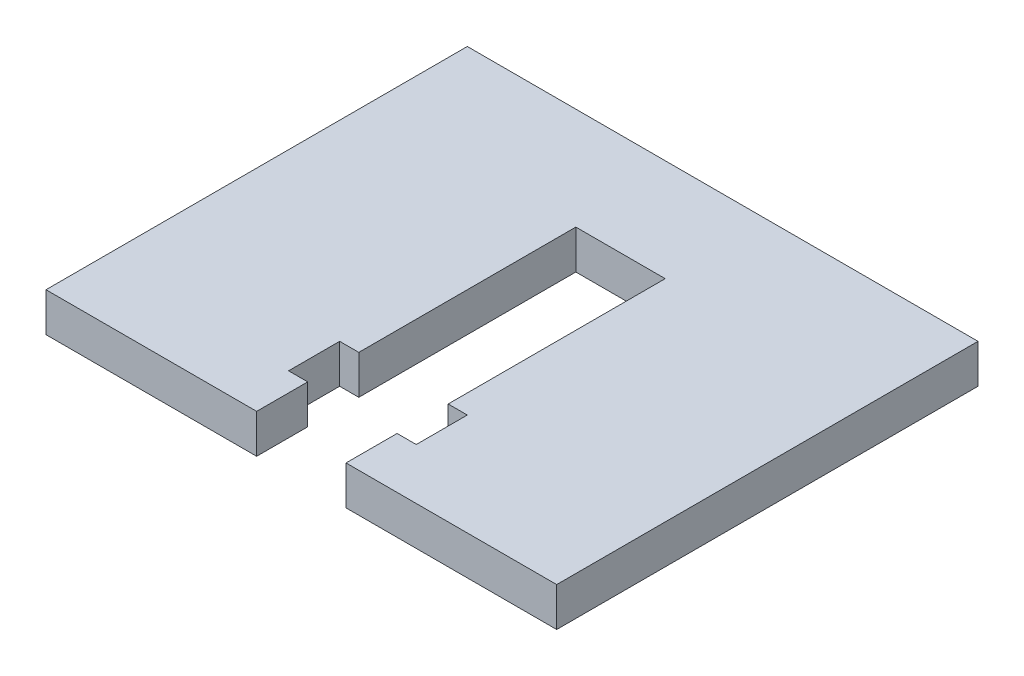
ISO-10303-21;
HEADER;
FILE_DESCRIPTION(('STEP AP214'),'2;1');
FILE_NAME('part.step','',(''),(''),'','','');
FILE_SCHEMA(('AUTOMOTIVE_DESIGN { 1 0 10303 214 1 1 1 1 }'));
ENDSEC;
DATA;
#1=APPLICATION_CONTEXT('core data for automotive mechanical design processes');
#2=APPLICATION_PROTOCOL_DEFINITION('international standard','automotive_design',2000,#1);
#3=PRODUCT_CONTEXT('',#1,'mechanical');
#4=PRODUCT('Part','Part','',(#3));
#5=PRODUCT_RELATED_PRODUCT_CATEGORY('part','',(#4));
#6=PRODUCT_DEFINITION_FORMATION('','',#4);
#7=PRODUCT_DEFINITION_CONTEXT('part definition',#1,'design');
#8=PRODUCT_DEFINITION('design','',#6,#7);
#9=PRODUCT_DEFINITION_SHAPE('','',#8);
#10=(LENGTH_UNIT() NAMED_UNIT(*) SI_UNIT(.MILLI.,.METRE.));
#11=(NAMED_UNIT(*) PLANE_ANGLE_UNIT() SI_UNIT($,.RADIAN.));
#12=(NAMED_UNIT(*) SI_UNIT($,.STERADIAN.) SOLID_ANGLE_UNIT());
#13=UNCERTAINTY_MEASURE_WITH_UNIT(LENGTH_MEASURE(1.E-05),#10,'distance_accuracy_value','');
#14=(GEOMETRIC_REPRESENTATION_CONTEXT(3) GLOBAL_UNCERTAINTY_ASSIGNED_CONTEXT((#13)) GLOBAL_UNIT_ASSIGNED_CONTEXT((#10,
#11,#12)) REPRESENTATION_CONTEXT('',''));
#15=CARTESIAN_POINT('',(0.,0.,0.));
#16=DIRECTION('',(0.,0.,1.));
#17=DIRECTION('',(1.,0.,0.));
#18=AXIS2_PLACEMENT_3D('',#15,#16,#17);
#19=CARTESIAN_POINT('',(16.5,3.05,0.));
#20=DIRECTION('',(0.,0.,-1.));
#21=DIRECTION('',(-1.,0.,0.));
#22=AXIS2_PLACEMENT_3D('',#19,#20,#21);
#23=PLANE('',#22);
#24=DIRECTION('',(1.,0.,0.));
#25=VECTOR('',#24,1.);
#26=CARTESIAN_POINT('',(16.5,0.,0.));
#27=LINE('',#26,#25);
#28=CARTESIAN_POINT('',(0.,0.,0.));
#29=VERTEX_POINT('',#28);
#30=CARTESIAN_POINT('',(16.5,0.,0.));
#31=VERTEX_POINT('',#30);
#32=EDGE_CURVE('E192',#29,#31,#27,.T.);
#33=ORIENTED_EDGE('',*,*,#32,.T.);
#34=DIRECTION('',(0.,-1.,0.));
#35=VECTOR('',#34,1.);
#36=CARTESIAN_POINT('',(16.5,3.05,0.));
#37=LINE('',#36,#35);
#38=CARTESIAN_POINT('',(16.5,3.05,0.));
#39=VERTEX_POINT('',#38);
#40=EDGE_CURVE('E11',#39,#31,#37,.T.);
#41=ORIENTED_EDGE('',*,*,#40,.F.);
#42=DIRECTION('',(1.,0.,0.));
#43=VECTOR('',#42,1.);
#44=CARTESIAN_POINT('',(16.5,3.05,0.));
#45=LINE('',#44,#43);
#46=CARTESIAN_POINT('',(0.,3.05,0.));
#47=VERTEX_POINT('',#46);
#48=EDGE_CURVE('E238',#47,#39,#45,.T.);
#49=ORIENTED_EDGE('',*,*,#48,.F.);
#50=DIRECTION('',(0.,-1.,0.));
#51=VECTOR('',#50,1.);
#52=CARTESIAN_POINT('',(0.,3.05,0.));
#53=LINE('',#52,#51);
#54=EDGE_CURVE('E188',#47,#29,#53,.T.);
#55=ORIENTED_EDGE('',*,*,#54,.T.);
#56=EDGE_LOOP('',(#33,#41,#49,#55));
#57=FACE_BOUND('',#56,.T.);
#58=ADVANCED_FACE('F43',(#57),#23,.F.);
#59=CARTESIAN_POINT('',(16.5,3.05,-3.99999999999999));
#60=DIRECTION('',(-1.,0.,0.));
#61=DIRECTION('',(0.,0.,1.));
#62=AXIS2_PLACEMENT_3D('',#59,#60,#61);
#63=PLANE('',#62);
#64=DIRECTION('',(0.,0.,-1.));
#65=VECTOR('',#64,1.);
#66=CARTESIAN_POINT('',(16.5,0.,-3.99999999999999));
#67=LINE('',#66,#65);
#68=CARTESIAN_POINT('',(16.5,0.,-3.99999999999999));
#69=VERTEX_POINT('',#68);
#70=EDGE_CURVE('E196',#31,#69,#67,.T.);
#71=ORIENTED_EDGE('',*,*,#70,.T.);
#72=DIRECTION('',(0.,-1.,0.));
#73=VECTOR('',#72,1.);
#74=CARTESIAN_POINT('',(16.5,3.05,-3.99999999999999));
#75=LINE('',#74,#73);
#76=CARTESIAN_POINT('',(16.5,3.05,-3.99999999999999));
#77=VERTEX_POINT('',#76);
#78=EDGE_CURVE('E52',#77,#69,#75,.T.);
#79=ORIENTED_EDGE('',*,*,#78,.F.);
#80=DIRECTION('',(0.,0.,-1.));
#81=VECTOR('',#80,1.);
#82=CARTESIAN_POINT('',(16.5,3.05,-3.99999999999999));
#83=LINE('',#82,#81);
#84=EDGE_CURVE('E127',#39,#77,#83,.T.);
#85=ORIENTED_EDGE('',*,*,#84,.F.);
#86=ORIENTED_EDGE('',*,*,#40,.T.);
#87=EDGE_LOOP('',(#71,#79,#85,#86));
#88=FACE_BOUND('',#87,.T.);
#89=ADVANCED_FACE('F360',(#88),#63,.F.);
#90=CARTESIAN_POINT('',(15.,3.05,-3.99999999999999));
#91=DIRECTION('',(0.,0.,1.));
#92=DIRECTION('',(1.,0.,0.));
#93=AXIS2_PLACEMENT_3D('',#90,#91,#92);
#94=PLANE('',#93);
#95=DIRECTION('',(-1.,0.,0.));
#96=VECTOR('',#95,1.);
#97=CARTESIAN_POINT('',(15.,0.,-3.99999999999999));
#98=LINE('',#97,#96);
#99=CARTESIAN_POINT('',(15.,0.,-3.99999999999999));
#100=VERTEX_POINT('',#99);
#101=EDGE_CURVE('E199',#69,#100,#98,.T.);
#102=ORIENTED_EDGE('',*,*,#101,.T.);
#103=DIRECTION('',(0.,-1.,0.));
#104=VECTOR('',#103,1.);
#105=CARTESIAN_POINT('',(15.,3.05,-3.99999999999999));
#106=LINE('',#105,#104);
#107=CARTESIAN_POINT('',(15.,3.05,-3.99999999999999));
#108=VERTEX_POINT('',#107);
#109=EDGE_CURVE('E281',#108,#100,#106,.T.);
#110=ORIENTED_EDGE('',*,*,#109,.F.);
#111=DIRECTION('',(-1.,0.,0.));
#112=VECTOR('',#111,1.);
#113=CARTESIAN_POINT('',(15.,3.05,-3.99999999999999));
#114=LINE('',#113,#112);
#115=EDGE_CURVE('E291',#77,#108,#114,.T.);
#116=ORIENTED_EDGE('',*,*,#115,.F.);
#117=ORIENTED_EDGE('',*,*,#78,.T.);
#118=EDGE_LOOP('',(#102,#110,#116,#117));
#119=FACE_BOUND('',#118,.T.);
#120=ADVANCED_FACE('F289',(#119),#94,.F.);
#121=CARTESIAN_POINT('',(15.,3.05,-7.99999999999999));
#122=DIRECTION('',(-1.,0.,0.));
#123=DIRECTION('',(0.,0.,1.));
#124=AXIS2_PLACEMENT_3D('',#121,#122,#123);
#125=PLANE('',#124);
#126=DIRECTION('',(0.,0.,-1.));
#127=VECTOR('',#126,1.);
#128=CARTESIAN_POINT('',(15.,0.,-7.99999999999999));
#129=LINE('',#128,#127);
#130=CARTESIAN_POINT('',(15.,0.,-7.99999999999999));
#131=VERTEX_POINT('',#130);
#132=EDGE_CURVE('E202',#100,#131,#129,.T.);
#133=ORIENTED_EDGE('',*,*,#132,.T.);
#134=DIRECTION('',(0.,-1.,0.));
#135=VECTOR('',#134,1.);
#136=CARTESIAN_POINT('',(15.,3.05,-7.99999999999999));
#137=LINE('',#136,#135);
#138=CARTESIAN_POINT('',(15.,3.05,-7.99999999999999));
#139=VERTEX_POINT('',#138);
#140=EDGE_CURVE('E277',#139,#131,#137,.T.);
#141=ORIENTED_EDGE('',*,*,#140,.F.);
#142=DIRECTION('',(0.,0.,-1.));
#143=VECTOR('',#142,1.);
#144=CARTESIAN_POINT('',(15.,3.05,-7.99999999999999));
#145=LINE('',#144,#143);
#146=EDGE_CURVE('E310',#108,#139,#145,.T.);
#147=ORIENTED_EDGE('',*,*,#146,.F.);
#148=ORIENTED_EDGE('',*,*,#109,.T.);
#149=EDGE_LOOP('',(#133,#141,#147,#148));
#150=FACE_BOUND('',#149,.T.);
#151=ADVANCED_FACE('F300',(#150),#125,.F.);
#152=CARTESIAN_POINT('',(16.5,3.05,-7.99999999999999));
#153=DIRECTION('',(0.,0.,-1.));
#154=DIRECTION('',(-1.,0.,0.));
#155=AXIS2_PLACEMENT_3D('',#152,#153,#154);
#156=PLANE('',#155);
#157=DIRECTION('',(1.,0.,0.));
#158=VECTOR('',#157,1.);
#159=CARTESIAN_POINT('',(16.5,0.,-7.99999999999999));
#160=LINE('',#159,#158);
#161=CARTESIAN_POINT('',(16.5,0.,-7.99999999999999));
#162=VERTEX_POINT('',#161);
#163=EDGE_CURVE('E205',#131,#162,#160,.T.);
#164=ORIENTED_EDGE('',*,*,#163,.T.);
#165=DIRECTION('',(0.,-1.,0.));
#166=VECTOR('',#165,1.);
#167=CARTESIAN_POINT('',(16.5,3.05,-7.99999999999999));
#168=LINE('',#167,#166);
#169=CARTESIAN_POINT('',(16.5,3.05,-7.99999999999999));
#170=VERTEX_POINT('',#169);
#171=EDGE_CURVE('E273',#170,#162,#168,.T.);
#172=ORIENTED_EDGE('',*,*,#171,.F.);
#173=DIRECTION('',(1.,0.,0.));
#174=VECTOR('',#173,1.);
#175=CARTESIAN_POINT('',(16.5,3.05,-7.99999999999999));
#176=LINE('',#175,#174);
#177=EDGE_CURVE('E306',#139,#170,#176,.T.);
#178=ORIENTED_EDGE('',*,*,#177,.F.);
#179=ORIENTED_EDGE('',*,*,#140,.T.);
#180=EDGE_LOOP('',(#164,#172,#178,#179));
#181=FACE_BOUND('',#180,.T.);
#182=ADVANCED_FACE('F304',(#181),#156,.F.);
#183=CARTESIAN_POINT('',(16.5,3.05,-25.));
#184=DIRECTION('',(-1.,0.,0.));
#185=DIRECTION('',(0.,0.,1.));
#186=AXIS2_PLACEMENT_3D('',#183,#184,#185);
#187=PLANE('',#186);
#188=DIRECTION('',(0.,0.,-1.));
#189=VECTOR('',#188,1.);
#190=CARTESIAN_POINT('',(16.5,0.,-25.));
#191=LINE('',#190,#189);
#192=CARTESIAN_POINT('',(16.5,0.,-25.));
#193=VERTEX_POINT('',#192);
#194=EDGE_CURVE('E208',#162,#193,#191,.T.);
#195=ORIENTED_EDGE('',*,*,#194,.T.);
#196=DIRECTION('',(0.,-1.,0.));
#197=VECTOR('',#196,1.);
#198=CARTESIAN_POINT('',(16.5,3.05,-25.));
#199=LINE('',#198,#197);
#200=CARTESIAN_POINT('',(16.5,3.05,-25.));
#201=VERTEX_POINT('',#200);
#202=EDGE_CURVE('E269',#201,#193,#199,.T.);
#203=ORIENTED_EDGE('',*,*,#202,.F.);
#204=DIRECTION('',(0.,0.,-1.));
#205=VECTOR('',#204,1.);
#206=CARTESIAN_POINT('',(16.5,3.05,-25.));
#207=LINE('',#206,#205);
#208=EDGE_CURVE('E309',#170,#201,#207,.T.);
#209=ORIENTED_EDGE('',*,*,#208,.F.);
#210=ORIENTED_EDGE('',*,*,#171,.T.);
#211=EDGE_LOOP('',(#195,#203,#209,#210));
#212=FACE_BOUND('',#211,.T.);
#213=ADVANCED_FACE('F373',(#212),#187,.F.);
#214=CARTESIAN_POINT('',(23.5,3.05,-25.));
#215=DIRECTION('',(0.,0.,-1.));
#216=DIRECTION('',(-1.,0.,0.));
#217=AXIS2_PLACEMENT_3D('',#214,#215,#216);
#218=PLANE('',#217);
#219=DIRECTION('',(1.,0.,0.));
#220=VECTOR('',#219,1.);
#221=CARTESIAN_POINT('',(23.5,0.,-25.));
#222=LINE('',#221,#220);
#223=CARTESIAN_POINT('',(23.5,0.,-25.));
#224=VERTEX_POINT('',#223);
#225=EDGE_CURVE('E211',#193,#224,#222,.T.);
#226=ORIENTED_EDGE('',*,*,#225,.T.);
#227=DIRECTION('',(0.,-1.,0.));
#228=VECTOR('',#227,1.);
#229=CARTESIAN_POINT('',(23.5,3.05,-25.));
#230=LINE('',#229,#228);
#231=CARTESIAN_POINT('',(23.5,3.05,-25.));
#232=VERTEX_POINT('',#231);
#233=EDGE_CURVE('E265',#232,#224,#230,.T.);
#234=ORIENTED_EDGE('',*,*,#233,.F.);
#235=DIRECTION('',(1.,0.,0.));
#236=VECTOR('',#235,1.);
#237=CARTESIAN_POINT('',(23.5,3.05,-25.));
#238=LINE('',#237,#236);
#239=EDGE_CURVE('E314',#201,#232,#238,.T.);
#240=ORIENTED_EDGE('',*,*,#239,.F.);
#241=ORIENTED_EDGE('',*,*,#202,.T.);
#242=EDGE_LOOP('',(#226,#234,#240,#241));
#243=FACE_BOUND('',#242,.T.);
#244=ADVANCED_FACE('F376',(#243),#218,.F.);
#245=CARTESIAN_POINT('',(23.5,3.05,-7.99999999999999));
#246=DIRECTION('',(1.,0.,0.));
#247=DIRECTION('',(0.,0.,-1.));
#248=AXIS2_PLACEMENT_3D('',#245,#246,#247);
#249=PLANE('',#248);
#250=DIRECTION('',(0.,0.,1.));
#251=VECTOR('',#250,1.);
#252=CARTESIAN_POINT('',(23.5,0.,-7.99999999999999));
#253=LINE('',#252,#251);
#254=CARTESIAN_POINT('',(23.5,0.,-7.99999999999999));
#255=VERTEX_POINT('',#254);
#256=EDGE_CURVE('E214',#224,#255,#253,.T.);
#257=ORIENTED_EDGE('',*,*,#256,.T.);
#258=DIRECTION('',(0.,-1.,0.));
#259=VECTOR('',#258,1.);
#260=CARTESIAN_POINT('',(23.5,3.05,-7.99999999999999));
#261=LINE('',#260,#259);
#262=CARTESIAN_POINT('',(23.5,3.05,-7.99999999999999));
#263=VERTEX_POINT('',#262);
#264=EDGE_CURVE('E261',#263,#255,#261,.T.);
#265=ORIENTED_EDGE('',*,*,#264,.F.);
#266=DIRECTION('',(0.,0.,1.));
#267=VECTOR('',#266,1.);
#268=CARTESIAN_POINT('',(23.5,3.05,-7.99999999999999));
#269=LINE('',#268,#267);
#270=EDGE_CURVE('E321',#232,#263,#269,.T.);
#271=ORIENTED_EDGE('',*,*,#270,.F.);
#272=ORIENTED_EDGE('',*,*,#233,.T.);
#273=EDGE_LOOP('',(#257,#265,#271,#272));
#274=FACE_BOUND('',#273,.T.);
#275=ADVANCED_FACE('F380',(#274),#249,.F.);
#276=CARTESIAN_POINT('',(25.,3.05,-7.99999999999999));
#277=DIRECTION('',(0.,0.,-1.));
#278=DIRECTION('',(-1.,0.,0.));
#279=AXIS2_PLACEMENT_3D('',#276,#277,#278);
#280=PLANE('',#279);
#281=DIRECTION('',(1.,0.,0.));
#282=VECTOR('',#281,1.);
#283=CARTESIAN_POINT('',(25.,0.,-7.99999999999999));
#284=LINE('',#283,#282);
#285=CARTESIAN_POINT('',(25.,0.,-7.99999999999999));
#286=VERTEX_POINT('',#285);
#287=EDGE_CURVE('E217',#255,#286,#284,.T.);
#288=ORIENTED_EDGE('',*,*,#287,.T.);
#289=DIRECTION('',(0.,-1.,0.));
#290=VECTOR('',#289,1.);
#291=CARTESIAN_POINT('',(25.,3.05,-7.99999999999999));
#292=LINE('',#291,#290);
#293=CARTESIAN_POINT('',(25.,3.05,-7.99999999999999));
#294=VERTEX_POINT('',#293);
#295=EDGE_CURVE('E257',#294,#286,#292,.T.);
#296=ORIENTED_EDGE('',*,*,#295,.F.);
#297=DIRECTION('',(1.,0.,0.));
#298=VECTOR('',#297,1.);
#299=CARTESIAN_POINT('',(25.,3.05,-7.99999999999999));
#300=LINE('',#299,#298);
#301=EDGE_CURVE('E324',#263,#294,#300,.T.);
#302=ORIENTED_EDGE('',*,*,#301,.F.);
#303=ORIENTED_EDGE('',*,*,#264,.T.);
#304=EDGE_LOOP('',(#288,#296,#302,#303));
#305=FACE_BOUND('',#304,.T.);
#306=ADVANCED_FACE('F384',(#305),#280,.F.);
#307=CARTESIAN_POINT('',(25.,3.05,-3.99999999999999));
#308=DIRECTION('',(1.,0.,0.));
#309=DIRECTION('',(0.,0.,-1.));
#310=AXIS2_PLACEMENT_3D('',#307,#308,#309);
#311=PLANE('',#310);
#312=DIRECTION('',(0.,0.,1.));
#313=VECTOR('',#312,1.);
#314=CARTESIAN_POINT('',(25.,0.,-3.99999999999999));
#315=LINE('',#314,#313);
#316=CARTESIAN_POINT('',(25.,0.,-3.99999999999999));
#317=VERTEX_POINT('',#316);
#318=EDGE_CURVE('E220',#286,#317,#315,.T.);
#319=ORIENTED_EDGE('',*,*,#318,.T.);
#320=DIRECTION('',(0.,-1.,0.));
#321=VECTOR('',#320,1.);
#322=CARTESIAN_POINT('',(25.,3.05,-3.99999999999999));
#323=LINE('',#322,#321);
#324=CARTESIAN_POINT('',(25.,3.05,-3.99999999999999));
#325=VERTEX_POINT('',#324);
#326=EDGE_CURVE('E253',#325,#317,#323,.T.);
#327=ORIENTED_EDGE('',*,*,#326,.F.);
#328=DIRECTION('',(0.,0.,1.));
#329=VECTOR('',#328,1.);
#330=CARTESIAN_POINT('',(25.,3.05,-3.99999999999999));
#331=LINE('',#330,#329);
#332=EDGE_CURVE('E327',#294,#325,#331,.T.);
#333=ORIENTED_EDGE('',*,*,#332,.F.);
#334=ORIENTED_EDGE('',*,*,#295,.T.);
#335=EDGE_LOOP('',(#319,#327,#333,#334));
#336=FACE_BOUND('',#335,.T.);
#337=ADVANCED_FACE('F388',(#336),#311,.F.);
#338=CARTESIAN_POINT('',(23.5,3.05,-3.99999999999999));
#339=DIRECTION('',(0.,0.,1.));
#340=DIRECTION('',(1.,0.,0.));
#341=AXIS2_PLACEMENT_3D('',#338,#339,#340);
#342=PLANE('',#341);
#343=DIRECTION('',(-1.,0.,0.));
#344=VECTOR('',#343,1.);
#345=CARTESIAN_POINT('',(23.5,0.,-3.99999999999999));
#346=LINE('',#345,#344);
#347=CARTESIAN_POINT('',(23.5,0.,-3.99999999999999));
#348=VERTEX_POINT('',#347);
#349=EDGE_CURVE('E223',#317,#348,#346,.T.);
#350=ORIENTED_EDGE('',*,*,#349,.T.);
#351=DIRECTION('',(0.,-1.,0.));
#352=VECTOR('',#351,1.);
#353=CARTESIAN_POINT('',(23.5,3.05,-3.99999999999999));
#354=LINE('',#353,#352);
#355=CARTESIAN_POINT('',(23.5,3.05,-3.99999999999999));
#356=VERTEX_POINT('',#355);
#357=EDGE_CURVE('E249',#356,#348,#354,.T.);
#358=ORIENTED_EDGE('',*,*,#357,.F.);
#359=DIRECTION('',(-1.,0.,0.));
#360=VECTOR('',#359,1.);
#361=CARTESIAN_POINT('',(23.5,3.05,-3.99999999999999));
#362=LINE('',#361,#360);
#363=EDGE_CURVE('E330',#325,#356,#362,.T.);
#364=ORIENTED_EDGE('',*,*,#363,.F.);
#365=ORIENTED_EDGE('',*,*,#326,.T.);
#366=EDGE_LOOP('',(#350,#358,#364,#365));
#367=FACE_BOUND('',#366,.T.);
#368=ADVANCED_FACE('F392',(#367),#342,.F.);
#369=CARTESIAN_POINT('',(23.5,3.05,0.));
#370=DIRECTION('',(1.,0.,0.));
#371=DIRECTION('',(0.,0.,-1.));
#372=AXIS2_PLACEMENT_3D('',#369,#370,#371);
#373=PLANE('',#372);
#374=DIRECTION('',(0.,0.,1.));
#375=VECTOR('',#374,1.);
#376=CARTESIAN_POINT('',(23.5,0.,0.));
#377=LINE('',#376,#375);
#378=CARTESIAN_POINT('',(23.5,0.,0.));
#379=VERTEX_POINT('',#378);
#380=EDGE_CURVE('E226',#348,#379,#377,.T.);
#381=ORIENTED_EDGE('',*,*,#380,.T.);
#382=DIRECTION('',(0.,-1.,0.));
#383=VECTOR('',#382,1.);
#384=CARTESIAN_POINT('',(23.5,3.05,0.));
#385=LINE('',#384,#383);
#386=CARTESIAN_POINT('',(23.5,3.05,0.));
#387=VERTEX_POINT('',#386);
#388=EDGE_CURVE('E245',#387,#379,#385,.T.);
#389=ORIENTED_EDGE('',*,*,#388,.F.);
#390=DIRECTION('',(0.,0.,1.));
#391=VECTOR('',#390,1.);
#392=CARTESIAN_POINT('',(23.5,3.05,0.));
#393=LINE('',#392,#391);
#394=EDGE_CURVE('E333',#356,#387,#393,.T.);
#395=ORIENTED_EDGE('',*,*,#394,.F.);
#396=ORIENTED_EDGE('',*,*,#357,.T.);
#397=EDGE_LOOP('',(#381,#389,#395,#396));
#398=FACE_BOUND('',#397,.T.);
#399=ADVANCED_FACE('F341',(#398),#373,.F.);
#400=CARTESIAN_POINT('',(40.,3.05,0.));
#401=DIRECTION('',(0.,0.,-1.));
#402=DIRECTION('',(-1.,0.,0.));
#403=AXIS2_PLACEMENT_3D('',#400,#401,#402);
#404=PLANE('',#403);
#405=DIRECTION('',(1.,0.,0.));
#406=VECTOR('',#405,1.);
#407=CARTESIAN_POINT('',(40.,0.,0.));
#408=LINE('',#407,#406);
#409=CARTESIAN_POINT('',(40.,0.,0.));
#410=VERTEX_POINT('',#409);
#411=EDGE_CURVE('E229',#379,#410,#408,.T.);
#412=ORIENTED_EDGE('',*,*,#411,.T.);
#413=DIRECTION('',(0.,-1.,0.));
#414=VECTOR('',#413,1.);
#415=CARTESIAN_POINT('',(40.,3.05,0.));
#416=LINE('',#415,#414);
#417=CARTESIAN_POINT('',(40.,3.05,0.));
#418=VERTEX_POINT('',#417);
#419=EDGE_CURVE('E181',#418,#410,#416,.T.);
#420=ORIENTED_EDGE('',*,*,#419,.F.);
#421=DIRECTION('',(1.,0.,0.));
#422=VECTOR('',#421,1.);
#423=CARTESIAN_POINT('',(40.,3.05,0.));
#424=LINE('',#423,#422);
#425=EDGE_CURVE('E170',#387,#418,#424,.T.);
#426=ORIENTED_EDGE('',*,*,#425,.F.);
#427=ORIENTED_EDGE('',*,*,#388,.T.);
#428=EDGE_LOOP('',(#412,#420,#426,#427));
#429=FACE_BOUND('',#428,.T.);
#430=ADVANCED_FACE('F345',(#429),#404,.F.);
#431=CARTESIAN_POINT('',(40.,3.05,-33.));
#432=DIRECTION('',(-1.,0.,0.));
#433=DIRECTION('',(0.,0.,1.));
#434=AXIS2_PLACEMENT_3D('',#431,#432,#433);
#435=PLANE('',#434);
#436=DIRECTION('',(0.,0.,-1.));
#437=VECTOR('',#436,1.);
#438=CARTESIAN_POINT('',(40.,0.,-33.));
#439=LINE('',#438,#437);
#440=CARTESIAN_POINT('',(40.,0.,-33.));
#441=VERTEX_POINT('',#440);
#442=EDGE_CURVE('E179',#410,#441,#439,.T.);
#443=ORIENTED_EDGE('',*,*,#442,.T.);
#444=DIRECTION('',(0.,-1.,0.));
#445=VECTOR('',#444,1.);
#446=CARTESIAN_POINT('',(40.,3.05,-33.));
#447=LINE('',#446,#445);
#448=CARTESIAN_POINT('',(40.,3.05,-33.));
#449=VERTEX_POINT('',#448);
#450=EDGE_CURVE('E176',#449,#441,#447,.T.);
#451=ORIENTED_EDGE('',*,*,#450,.F.);
#452=DIRECTION('',(0.,0.,-1.));
#453=VECTOR('',#452,1.);
#454=CARTESIAN_POINT('',(40.,3.05,-33.));
#455=LINE('',#454,#453);
#456=EDGE_CURVE('E164',#418,#449,#455,.T.);
#457=ORIENTED_EDGE('',*,*,#456,.F.);
#458=ORIENTED_EDGE('',*,*,#419,.T.);
#459=EDGE_LOOP('',(#443,#451,#457,#458));
#460=FACE_BOUND('',#459,.T.);
#461=ADVANCED_FACE('F177',(#460),#435,.F.);
#462=CARTESIAN_POINT('',(0.,3.05,-33.));
#463=DIRECTION('',(0.,0.,1.));
#464=DIRECTION('',(1.,0.,0.));
#465=AXIS2_PLACEMENT_3D('',#462,#463,#464);
#466=PLANE('',#465);
#467=DIRECTION('',(-1.,0.,0.));
#468=VECTOR('',#467,1.);
#469=CARTESIAN_POINT('',(0.,0.,-33.));
#470=LINE('',#469,#468);
#471=CARTESIAN_POINT('',(0.,0.,-33.));
#472=VERTEX_POINT('',#471);
#473=EDGE_CURVE('E113',#441,#472,#470,.T.);
#474=ORIENTED_EDGE('',*,*,#473,.T.);
#475=DIRECTION('',(0.,-1.,0.));
#476=VECTOR('',#475,1.);
#477=CARTESIAN_POINT('',(0.,3.05,-33.));
#478=LINE('',#477,#476);
#479=CARTESIAN_POINT('',(0.,3.05,-33.));
#480=VERTEX_POINT('',#479);
#481=EDGE_CURVE('E182',#480,#472,#478,.T.);
#482=ORIENTED_EDGE('',*,*,#481,.F.);
#483=DIRECTION('',(-1.,0.,0.));
#484=VECTOR('',#483,1.);
#485=CARTESIAN_POINT('',(0.,3.05,-33.));
#486=LINE('',#485,#484);
#487=EDGE_CURVE('E168',#449,#480,#486,.T.);
#488=ORIENTED_EDGE('',*,*,#487,.F.);
#489=ORIENTED_EDGE('',*,*,#450,.T.);
#490=EDGE_LOOP('',(#474,#482,#488,#489));
#491=FACE_BOUND('',#490,.T.);
#492=ADVANCED_FACE('F184',(#491),#466,.F.);
#493=CARTESIAN_POINT('',(0.,3.05,0.));
#494=DIRECTION('',(1.,0.,0.));
#495=DIRECTION('',(0.,0.,-1.));
#496=AXIS2_PLACEMENT_3D('',#493,#494,#495);
#497=PLANE('',#496);
#498=DIRECTION('',(0.,0.,1.));
#499=VECTOR('',#498,1.);
#500=CARTESIAN_POINT('',(0.,0.,0.));
#501=LINE('',#500,#499);
#502=EDGE_CURVE('E119',#472,#29,#501,.T.);
#503=ORIENTED_EDGE('',*,*,#502,.T.);
#504=ORIENTED_EDGE('',*,*,#54,.F.);
#505=DIRECTION('',(0.,0.,1.));
#506=VECTOR('',#505,1.);
#507=CARTESIAN_POINT('',(0.,3.05,0.));
#508=LINE('',#507,#506);
#509=EDGE_CURVE('E60',#480,#47,#508,.T.);
#510=ORIENTED_EDGE('',*,*,#509,.F.);
#511=ORIENTED_EDGE('',*,*,#481,.T.);
#512=EDGE_LOOP('',(#503,#504,#510,#511));
#513=FACE_BOUND('',#512,.T.);
#514=ADVANCED_FACE('F349',(#513),#497,.F.);
#515=CARTESIAN_POINT('',(0.,3.05,0.));
#516=DIRECTION('',(0.,-1.,0.));
#517=DIRECTION('',(0.,0.,-1.));
#518=AXIS2_PLACEMENT_3D('',#515,#516,#517);
#519=PLANE('',#518);
#520=ORIENTED_EDGE('',*,*,#48,.T.);
#521=ORIENTED_EDGE('',*,*,#84,.T.);
#522=ORIENTED_EDGE('',*,*,#115,.T.);
#523=ORIENTED_EDGE('',*,*,#146,.T.);
#524=ORIENTED_EDGE('',*,*,#177,.T.);
#525=ORIENTED_EDGE('',*,*,#208,.T.);
#526=ORIENTED_EDGE('',*,*,#239,.T.);
#527=ORIENTED_EDGE('',*,*,#270,.T.);
#528=ORIENTED_EDGE('',*,*,#301,.T.);
#529=ORIENTED_EDGE('',*,*,#332,.T.);
#530=ORIENTED_EDGE('',*,*,#363,.T.);
#531=ORIENTED_EDGE('',*,*,#394,.T.);
#532=ORIENTED_EDGE('',*,*,#425,.T.);
#533=ORIENTED_EDGE('',*,*,#456,.T.);
#534=ORIENTED_EDGE('',*,*,#487,.T.);
#535=ORIENTED_EDGE('',*,*,#509,.T.);
#536=EDGE_LOOP('',(#520,#521,#522,#523,#524,#525,#526,#527,#528,#529,#530,#531,#532,#533,#534,#535));
#537=FACE_BOUND('',#536,.T.);
#538=ADVANCED_FACE('F166',(#537),#519,.F.);
#539=CARTESIAN_POINT('',(0.,0.,0.));
#540=DIRECTION('',(0.,-1.,0.));
#541=DIRECTION('',(0.,0.,-1.));
#542=AXIS2_PLACEMENT_3D('',#539,#540,#541);
#543=PLANE('',#542);
#544=ORIENTED_EDGE('',*,*,#32,.F.);
#545=ORIENTED_EDGE('',*,*,#502,.F.);
#546=ORIENTED_EDGE('',*,*,#473,.F.);
#547=ORIENTED_EDGE('',*,*,#442,.F.);
#548=ORIENTED_EDGE('',*,*,#411,.F.);
#549=ORIENTED_EDGE('',*,*,#380,.F.);
#550=ORIENTED_EDGE('',*,*,#349,.F.);
#551=ORIENTED_EDGE('',*,*,#318,.F.);
#552=ORIENTED_EDGE('',*,*,#287,.F.);
#553=ORIENTED_EDGE('',*,*,#256,.F.);
#554=ORIENTED_EDGE('',*,*,#225,.F.);
#555=ORIENTED_EDGE('',*,*,#194,.F.);
#556=ORIENTED_EDGE('',*,*,#163,.F.);
#557=ORIENTED_EDGE('',*,*,#132,.F.);
#558=ORIENTED_EDGE('',*,*,#101,.F.);
#559=ORIENTED_EDGE('',*,*,#70,.F.);
#560=EDGE_LOOP('',(#544,#545,#546,#547,#548,#549,#550,#551,#552,#553,#554,#555,#556,#557,#558,#559));
#561=FACE_BOUND('',#560,.T.);
#562=ADVANCED_FACE('F295',(#561),#543,.T.);
#563=CLOSED_SHELL('',(#58,#89,#120,#151,#182,#213,#244,#275,#306,#337,#368,#399,#430,#461,#492,
#514,#538,#562));
#564=MANIFOLD_SOLID_BREP('B2',#563);
#565=ADVANCED_BREP_SHAPE_REPRESENTATION('',(#18,#564),#14);
#566=SHAPE_DEFINITION_REPRESENTATION(#9,#565);
ENDSEC;
END-ISO-10303-21;
